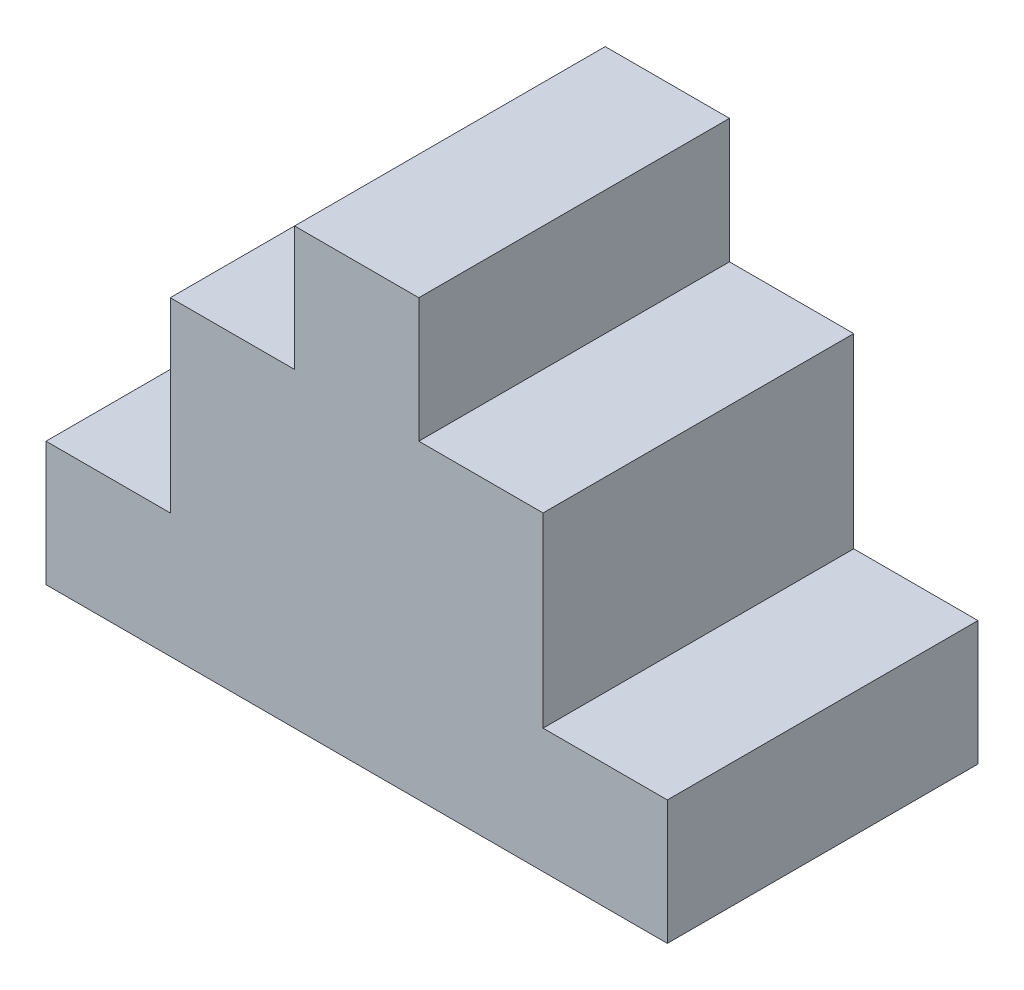
ISO-10303-21;
HEADER;
FILE_DESCRIPTION(('STEP AP214'),'2;1');
FILE_NAME('part.step','',(''),(''),'','','');
FILE_SCHEMA(('AUTOMOTIVE_DESIGN { 1 0 10303 214 1 1 1 1 }'));
ENDSEC;
DATA;
#1=APPLICATION_CONTEXT('core data for automotive mechanical design processes');
#2=APPLICATION_PROTOCOL_DEFINITION('international standard','automotive_design',2000,#1);
#3=PRODUCT_CONTEXT('',#1,'mechanical');
#4=PRODUCT('Part','Part','',(#3));
#5=PRODUCT_RELATED_PRODUCT_CATEGORY('part','',(#4));
#6=PRODUCT_DEFINITION_FORMATION('','',#4);
#7=PRODUCT_DEFINITION_CONTEXT('part definition',#1,'design');
#8=PRODUCT_DEFINITION('design','',#6,#7);
#9=PRODUCT_DEFINITION_SHAPE('','',#8);
#10=(LENGTH_UNIT() NAMED_UNIT(*) SI_UNIT(.MILLI.,.METRE.));
#11=(NAMED_UNIT(*) PLANE_ANGLE_UNIT() SI_UNIT($,.RADIAN.));
#12=(NAMED_UNIT(*) SI_UNIT($,.STERADIAN.) SOLID_ANGLE_UNIT());
#13=UNCERTAINTY_MEASURE_WITH_UNIT(LENGTH_MEASURE(1.E-05),#10,'distance_accuracy_value','');
#14=(GEOMETRIC_REPRESENTATION_CONTEXT(3) GLOBAL_UNCERTAINTY_ASSIGNED_CONTEXT((#13)) GLOBAL_UNIT_ASSIGNED_CONTEXT((#10,
#11,#12)) REPRESENTATION_CONTEXT('',''));
#15=CARTESIAN_POINT('',(0.,0.,0.));
#16=DIRECTION('',(0.,0.,1.));
#17=DIRECTION('',(1.,0.,0.));
#18=AXIS2_PLACEMENT_3D('',#15,#16,#17);
#19=CARTESIAN_POINT('',(0.999999999999999,7.,2.5));
#20=DIRECTION('',(-1.,0.,0.));
#21=DIRECTION('',(0.,-1.,0.));
#22=AXIS2_PLACEMENT_3D('',#19,#20,#21);
#23=PLANE('',#22);
#24=DIRECTION('',(0.,1.,0.));
#25=VECTOR('',#24,1.);
#26=CARTESIAN_POINT('',(0.999999999999999,7.,-2.5));
#27=LINE('',#26,#25);
#28=CARTESIAN_POINT('',(1.,5.,-2.5));
#29=VERTEX_POINT('',#28);
#30=CARTESIAN_POINT('',(0.999999999999999,7.,-2.5));
#31=VERTEX_POINT('',#30);
#32=EDGE_CURVE('E157',#29,#31,#27,.T.);
#33=ORIENTED_EDGE('',*,*,#32,.T.);
#34=DIRECTION('',(0.,0.,-1.));
#35=VECTOR('',#34,1.);
#36=CARTESIAN_POINT('',(0.999999999999999,7.,2.5));
#37=LINE('',#36,#35);
#38=CARTESIAN_POINT('',(0.999999999999999,7.,2.5));
#39=VERTEX_POINT('',#38);
#40=EDGE_CURVE('E11',#39,#31,#37,.T.);
#41=ORIENTED_EDGE('',*,*,#40,.F.);
#42=DIRECTION('',(0.,1.,0.));
#43=VECTOR('',#42,1.);
#44=CARTESIAN_POINT('',(0.999999999999999,7.,2.5));
#45=LINE('',#44,#43);
#46=CARTESIAN_POINT('',(1.,5.,2.5));
#47=VERTEX_POINT('',#46);
#48=EDGE_CURVE('E179',#47,#39,#45,.T.);
#49=ORIENTED_EDGE('',*,*,#48,.F.);
#50=DIRECTION('',(0.,0.,-1.));
#51=VECTOR('',#50,1.);
#52=CARTESIAN_POINT('',(1.,5.,2.5));
#53=LINE('',#52,#51);
#54=EDGE_CURVE('E153',#47,#29,#53,.T.);
#55=ORIENTED_EDGE('',*,*,#54,.T.);
#56=EDGE_LOOP('',(#33,#41,#49,#55));
#57=FACE_BOUND('',#56,.T.);
#58=ADVANCED_FACE('F37',(#57),#23,.F.);
#59=CARTESIAN_POINT('',(-1.,7.,2.5));
#60=DIRECTION('',(0.,-1.,0.));
#61=DIRECTION('',(0.,0.,-1.));
#62=AXIS2_PLACEMENT_3D('',#59,#60,#61);
#63=PLANE('',#62);
#64=DIRECTION('',(-1.,0.,0.));
#65=VECTOR('',#64,1.);
#66=CARTESIAN_POINT('',(-1.,7.,-2.5));
#67=LINE('',#66,#65);
#68=CARTESIAN_POINT('',(-1.,7.,-2.5));
#69=VERTEX_POINT('',#68);
#70=EDGE_CURVE('E160',#31,#69,#67,.T.);
#71=ORIENTED_EDGE('',*,*,#70,.T.);
#72=DIRECTION('',(0.,0.,-1.));
#73=VECTOR('',#72,1.);
#74=CARTESIAN_POINT('',(-1.,7.,2.5));
#75=LINE('',#74,#73);
#76=CARTESIAN_POINT('',(-1.,7.,2.5));
#77=VERTEX_POINT('',#76);
#78=EDGE_CURVE('E45',#77,#69,#75,.T.);
#79=ORIENTED_EDGE('',*,*,#78,.F.);
#80=DIRECTION('',(-1.,0.,0.));
#81=VECTOR('',#80,1.);
#82=CARTESIAN_POINT('',(-1.,7.,2.5));
#83=LINE('',#82,#81);
#84=EDGE_CURVE('E108',#39,#77,#83,.T.);
#85=ORIENTED_EDGE('',*,*,#84,.F.);
#86=ORIENTED_EDGE('',*,*,#40,.T.);
#87=EDGE_LOOP('',(#71,#79,#85,#86));
#88=FACE_BOUND('',#87,.T.);
#89=ADVANCED_FACE('F257',(#88),#63,.F.);
#90=CARTESIAN_POINT('',(-1.,7.,2.5));
#91=DIRECTION('',(1.,0.,0.));
#92=DIRECTION('',(0.,1.,0.));
#93=AXIS2_PLACEMENT_3D('',#90,#91,#92);
#94=PLANE('',#93);
#95=DIRECTION('',(0.,-1.,0.));
#96=VECTOR('',#95,1.);
#97=CARTESIAN_POINT('',(-1.,7.,-2.5));
#98=LINE('',#97,#96);
#99=CARTESIAN_POINT('',(-1.,5.,-2.5));
#100=VERTEX_POINT('',#99);
#101=EDGE_CURVE('E162',#69,#100,#98,.T.);
#102=ORIENTED_EDGE('',*,*,#101,.T.);
#103=DIRECTION('',(0.,0.,-1.));
#104=VECTOR('',#103,1.);
#105=CARTESIAN_POINT('',(-1.,5.,2.5));
#106=LINE('',#105,#104);
#107=CARTESIAN_POINT('',(-1.,5.,2.5));
#108=VERTEX_POINT('',#107);
#109=EDGE_CURVE('E198',#108,#100,#106,.T.);
#110=ORIENTED_EDGE('',*,*,#109,.F.);
#111=DIRECTION('',(0.,-1.,0.));
#112=VECTOR('',#111,1.);
#113=CARTESIAN_POINT('',(-1.,7.,2.5));
#114=LINE('',#113,#112);
#115=EDGE_CURVE('E206',#77,#108,#114,.T.);
#116=ORIENTED_EDGE('',*,*,#115,.F.);
#117=ORIENTED_EDGE('',*,*,#78,.T.);
#118=EDGE_LOOP('',(#102,#110,#116,#117));
#119=FACE_BOUND('',#118,.T.);
#120=ADVANCED_FACE('F204',(#119),#94,.F.);
#121=CARTESIAN_POINT('',(-1.,5.,2.5));
#122=DIRECTION('',(0.,-1.,0.));
#123=DIRECTION('',(1.,0.,0.));
#124=AXIS2_PLACEMENT_3D('',#121,#122,#123);
#125=PLANE('',#124);
#126=DIRECTION('',(-1.,0.,0.));
#127=VECTOR('',#126,1.);
#128=CARTESIAN_POINT('',(-1.,5.,-2.5));
#129=LINE('',#128,#127);
#130=CARTESIAN_POINT('',(-3.,5.,-2.5));
#131=VERTEX_POINT('',#130);
#132=EDGE_CURVE('E164',#100,#131,#129,.T.);
#133=ORIENTED_EDGE('',*,*,#132,.T.);
#134=DIRECTION('',(0.,0.,-1.));
#135=VECTOR('',#134,1.);
#136=CARTESIAN_POINT('',(-3.,5.,2.5));
#137=LINE('',#136,#135);
#138=CARTESIAN_POINT('',(-3.,5.,2.5));
#139=VERTEX_POINT('',#138);
#140=EDGE_CURVE('E195',#139,#131,#137,.T.);
#141=ORIENTED_EDGE('',*,*,#140,.F.);
#142=DIRECTION('',(-1.,0.,0.));
#143=VECTOR('',#142,1.);
#144=CARTESIAN_POINT('',(-1.,5.,2.5));
#145=LINE('',#144,#143);
#146=EDGE_CURVE('E224',#108,#139,#145,.T.);
#147=ORIENTED_EDGE('',*,*,#146,.F.);
#148=ORIENTED_EDGE('',*,*,#109,.T.);
#149=EDGE_LOOP('',(#133,#141,#147,#148));
#150=FACE_BOUND('',#149,.T.);
#151=ADVANCED_FACE('F215',(#150),#125,.F.);
#152=CARTESIAN_POINT('',(-3.,5.,2.5));
#153=DIRECTION('',(1.,0.,0.));
#154=DIRECTION('',(0.,1.,0.));
#155=AXIS2_PLACEMENT_3D('',#152,#153,#154);
#156=PLANE('',#155);
#157=DIRECTION('',(0.,-1.,0.));
#158=VECTOR('',#157,1.);
#159=CARTESIAN_POINT('',(-3.,5.,-2.5));
#160=LINE('',#159,#158);
#161=CARTESIAN_POINT('',(-3.,2.,-2.5));
#162=VERTEX_POINT('',#161);
#163=EDGE_CURVE('E166',#131,#162,#160,.T.);
#164=ORIENTED_EDGE('',*,*,#163,.T.);
#165=DIRECTION('',(0.,0.,-1.));
#166=VECTOR('',#165,1.);
#167=CARTESIAN_POINT('',(-3.,2.,2.5));
#168=LINE('',#167,#166);
#169=CARTESIAN_POINT('',(-3.,2.,2.5));
#170=VERTEX_POINT('',#169);
#171=EDGE_CURVE('E192',#170,#162,#168,.T.);
#172=ORIENTED_EDGE('',*,*,#171,.F.);
#173=DIRECTION('',(0.,-1.,0.));
#174=VECTOR('',#173,1.);
#175=CARTESIAN_POINT('',(-3.,5.,2.5));
#176=LINE('',#175,#174);
#177=EDGE_CURVE('E221',#139,#170,#176,.T.);
#178=ORIENTED_EDGE('',*,*,#177,.F.);
#179=ORIENTED_EDGE('',*,*,#140,.T.);
#180=EDGE_LOOP('',(#164,#172,#178,#179));
#181=FACE_BOUND('',#180,.T.);
#182=ADVANCED_FACE('F219',(#181),#156,.F.);
#183=CARTESIAN_POINT('',(-3.,2.,2.5));
#184=DIRECTION('',(0.,-1.,0.));
#185=DIRECTION('',(1.,0.,0.));
#186=AXIS2_PLACEMENT_3D('',#183,#184,#185);
#187=PLANE('',#186);
#188=DIRECTION('',(-1.,0.,0.));
#189=VECTOR('',#188,1.);
#190=CARTESIAN_POINT('',(-3.,2.,-2.5));
#191=LINE('',#190,#189);
#192=CARTESIAN_POINT('',(-5.,2.,-2.5));
#193=VERTEX_POINT('',#192);
#194=EDGE_CURVE('E168',#162,#193,#191,.T.);
#195=ORIENTED_EDGE('',*,*,#194,.T.);
#196=DIRECTION('',(0.,0.,-1.));
#197=VECTOR('',#196,1.);
#198=CARTESIAN_POINT('',(-5.,2.,2.5));
#199=LINE('',#198,#197);
#200=CARTESIAN_POINT('',(-5.,2.,2.5));
#201=VERTEX_POINT('',#200);
#202=EDGE_CURVE('E189',#201,#193,#199,.T.);
#203=ORIENTED_EDGE('',*,*,#202,.F.);
#204=DIRECTION('',(-1.,0.,0.));
#205=VECTOR('',#204,1.);
#206=CARTESIAN_POINT('',(-3.,2.,2.5));
#207=LINE('',#206,#205);
#208=EDGE_CURVE('E223',#170,#201,#207,.T.);
#209=ORIENTED_EDGE('',*,*,#208,.F.);
#210=ORIENTED_EDGE('',*,*,#171,.T.);
#211=EDGE_LOOP('',(#195,#203,#209,#210));
#212=FACE_BOUND('',#211,.T.);
#213=ADVANCED_FACE('F270',(#212),#187,.F.);
#214=CARTESIAN_POINT('',(-5.,2.,2.5));
#215=DIRECTION('',(1.,0.,0.));
#216=DIRECTION('',(0.,1.,0.));
#217=AXIS2_PLACEMENT_3D('',#214,#215,#216);
#218=PLANE('',#217);
#219=DIRECTION('',(0.,-1.,0.));
#220=VECTOR('',#219,1.);
#221=CARTESIAN_POINT('',(-5.,2.,-2.5));
#222=LINE('',#221,#220);
#223=CARTESIAN_POINT('',(-5.,0.,-2.5));
#224=VERTEX_POINT('',#223);
#225=EDGE_CURVE('E170',#193,#224,#222,.T.);
#226=ORIENTED_EDGE('',*,*,#225,.T.);
#227=DIRECTION('',(0.,0.,-1.));
#228=VECTOR('',#227,1.);
#229=CARTESIAN_POINT('',(-5.,0.,2.5));
#230=LINE('',#229,#228);
#231=CARTESIAN_POINT('',(-5.,0.,2.5));
#232=VERTEX_POINT('',#231);
#233=EDGE_CURVE('E186',#232,#224,#230,.T.);
#234=ORIENTED_EDGE('',*,*,#233,.F.);
#235=DIRECTION('',(0.,-1.,0.));
#236=VECTOR('',#235,1.);
#237=CARTESIAN_POINT('',(-5.,2.,2.5));
#238=LINE('',#237,#236);
#239=EDGE_CURVE('E226',#201,#232,#238,.T.);
#240=ORIENTED_EDGE('',*,*,#239,.F.);
#241=ORIENTED_EDGE('',*,*,#202,.T.);
#242=EDGE_LOOP('',(#226,#234,#240,#241));
#243=FACE_BOUND('',#242,.T.);
#244=ADVANCED_FACE('F273',(#243),#218,.F.);
#245=CARTESIAN_POINT('',(5.,0.,2.5));
#246=DIRECTION('',(0.,1.,0.));
#247=DIRECTION('',(0.,0.,1.));
#248=AXIS2_PLACEMENT_3D('',#245,#246,#247);
#249=PLANE('',#248);
#250=DIRECTION('',(1.,0.,0.));
#251=VECTOR('',#250,1.);
#252=CARTESIAN_POINT('',(5.,0.,-2.5));
#253=LINE('',#252,#251);
#254=CARTESIAN_POINT('',(5.,0.,-2.5));
#255=VERTEX_POINT('',#254);
#256=EDGE_CURVE('E172',#224,#255,#253,.T.);
#257=ORIENTED_EDGE('',*,*,#256,.T.);
#258=DIRECTION('',(0.,0.,-1.));
#259=VECTOR('',#258,1.);
#260=CARTESIAN_POINT('',(5.,0.,2.5));
#261=LINE('',#260,#259);
#262=CARTESIAN_POINT('',(5.,0.,2.5));
#263=VERTEX_POINT('',#262);
#264=EDGE_CURVE('E183',#263,#255,#261,.T.);
#265=ORIENTED_EDGE('',*,*,#264,.F.);
#266=DIRECTION('',(1.,0.,0.));
#267=VECTOR('',#266,1.);
#268=CARTESIAN_POINT('',(5.,0.,2.5));
#269=LINE('',#268,#267);
#270=EDGE_CURVE('E232',#232,#263,#269,.T.);
#271=ORIENTED_EDGE('',*,*,#270,.F.);
#272=ORIENTED_EDGE('',*,*,#233,.T.);
#273=EDGE_LOOP('',(#257,#265,#271,#272));
#274=FACE_BOUND('',#273,.T.);
#275=ADVANCED_FACE('F238',(#274),#249,.F.);
#276=CARTESIAN_POINT('',(5.,2.,2.5));
#277=DIRECTION('',(-1.,0.,0.));
#278=DIRECTION('',(0.,-1.,0.));
#279=AXIS2_PLACEMENT_3D('',#276,#277,#278);
#280=PLANE('',#279);
#281=DIRECTION('',(0.,1.,0.));
#282=VECTOR('',#281,1.);
#283=CARTESIAN_POINT('',(5.,2.,-2.5));
#284=LINE('',#283,#282);
#285=CARTESIAN_POINT('',(5.,2.,-2.5));
#286=VERTEX_POINT('',#285);
#287=EDGE_CURVE('E174',#255,#286,#284,.T.);
#288=ORIENTED_EDGE('',*,*,#287,.T.);
#289=DIRECTION('',(0.,0.,-1.));
#290=VECTOR('',#289,1.);
#291=CARTESIAN_POINT('',(5.,2.,2.5));
#292=LINE('',#291,#290);
#293=CARTESIAN_POINT('',(5.,2.,2.5));
#294=VERTEX_POINT('',#293);
#295=EDGE_CURVE('E148',#294,#286,#292,.T.);
#296=ORIENTED_EDGE('',*,*,#295,.F.);
#297=DIRECTION('',(0.,1.,0.));
#298=VECTOR('',#297,1.);
#299=CARTESIAN_POINT('',(5.,2.,2.5));
#300=LINE('',#299,#298);
#301=EDGE_CURVE('E139',#263,#294,#300,.T.);
#302=ORIENTED_EDGE('',*,*,#301,.F.);
#303=ORIENTED_EDGE('',*,*,#264,.T.);
#304=EDGE_LOOP('',(#288,#296,#302,#303));
#305=FACE_BOUND('',#304,.T.);
#306=ADVANCED_FACE('F242',(#305),#280,.F.);
#307=CARTESIAN_POINT('',(3.,2.,2.5));
#308=DIRECTION('',(0.,-1.,0.));
#309=DIRECTION('',(1.,0.,0.));
#310=AXIS2_PLACEMENT_3D('',#307,#308,#309);
#311=PLANE('',#310);
#312=DIRECTION('',(-1.,0.,0.));
#313=VECTOR('',#312,1.);
#314=CARTESIAN_POINT('',(3.,2.,-2.5));
#315=LINE('',#314,#313);
#316=CARTESIAN_POINT('',(3.,2.,-2.5));
#317=VERTEX_POINT('',#316);
#318=EDGE_CURVE('E147',#286,#317,#315,.T.);
#319=ORIENTED_EDGE('',*,*,#318,.T.);
#320=DIRECTION('',(0.,0.,-1.));
#321=VECTOR('',#320,1.);
#322=CARTESIAN_POINT('',(3.,2.,2.5));
#323=LINE('',#322,#321);
#324=CARTESIAN_POINT('',(3.,2.,2.5));
#325=VERTEX_POINT('',#324);
#326=EDGE_CURVE('E144',#325,#317,#323,.T.);
#327=ORIENTED_EDGE('',*,*,#326,.F.);
#328=DIRECTION('',(-1.,0.,0.));
#329=VECTOR('',#328,1.);
#330=CARTESIAN_POINT('',(3.,2.,2.5));
#331=LINE('',#330,#329);
#332=EDGE_CURVE('E133',#294,#325,#331,.T.);
#333=ORIENTED_EDGE('',*,*,#332,.F.);
#334=ORIENTED_EDGE('',*,*,#295,.T.);
#335=EDGE_LOOP('',(#319,#327,#333,#334));
#336=FACE_BOUND('',#335,.T.);
#337=ADVANCED_FACE('F145',(#336),#311,.F.);
#338=CARTESIAN_POINT('',(3.,5.,2.5));
#339=DIRECTION('',(-1.,0.,0.));
#340=DIRECTION('',(0.,-1.,0.));
#341=AXIS2_PLACEMENT_3D('',#338,#339,#340);
#342=PLANE('',#341);
#343=DIRECTION('',(0.,1.,0.));
#344=VECTOR('',#343,1.);
#345=CARTESIAN_POINT('',(3.,5.,-2.5));
#346=LINE('',#345,#344);
#347=CARTESIAN_POINT('',(3.,5.,-2.5));
#348=VERTEX_POINT('',#347);
#349=EDGE_CURVE('E94',#317,#348,#346,.T.);
#350=ORIENTED_EDGE('',*,*,#349,.T.);
#351=DIRECTION('',(0.,0.,-1.));
#352=VECTOR('',#351,1.);
#353=CARTESIAN_POINT('',(3.,5.,2.5));
#354=LINE('',#353,#352);
#355=CARTESIAN_POINT('',(3.,5.,2.5));
#356=VERTEX_POINT('',#355);
#357=EDGE_CURVE('E149',#356,#348,#354,.T.);
#358=ORIENTED_EDGE('',*,*,#357,.F.);
#359=DIRECTION('',(0.,1.,0.));
#360=VECTOR('',#359,1.);
#361=CARTESIAN_POINT('',(3.,5.,2.5));
#362=LINE('',#361,#360);
#363=EDGE_CURVE('E137',#325,#356,#362,.T.);
#364=ORIENTED_EDGE('',*,*,#363,.F.);
#365=ORIENTED_EDGE('',*,*,#326,.T.);
#366=EDGE_LOOP('',(#350,#358,#364,#365));
#367=FACE_BOUND('',#366,.T.);
#368=ADVANCED_FACE('F151',(#367),#342,.F.);
#369=CARTESIAN_POINT('',(1.,5.,2.5));
#370=DIRECTION('',(0.,-1.,0.));
#371=DIRECTION('',(1.,0.,0.));
#372=AXIS2_PLACEMENT_3D('',#369,#370,#371);
#373=PLANE('',#372);
#374=DIRECTION('',(-1.,0.,0.));
#375=VECTOR('',#374,1.);
#376=CARTESIAN_POINT('',(1.,5.,-2.5));
#377=LINE('',#376,#375);
#378=EDGE_CURVE('E100',#348,#29,#377,.T.);
#379=ORIENTED_EDGE('',*,*,#378,.T.);
#380=ORIENTED_EDGE('',*,*,#54,.F.);
#381=DIRECTION('',(-1.,0.,0.));
#382=VECTOR('',#381,1.);
#383=CARTESIAN_POINT('',(1.,5.,2.5));
#384=LINE('',#383,#382);
#385=EDGE_CURVE('E53',#356,#47,#384,.T.);
#386=ORIENTED_EDGE('',*,*,#385,.F.);
#387=ORIENTED_EDGE('',*,*,#357,.T.);
#388=EDGE_LOOP('',(#379,#380,#386,#387));
#389=FACE_BOUND('',#388,.T.);
#390=ADVANCED_FACE('F246',(#389),#373,.F.);
#391=CARTESIAN_POINT('',(0.,0.,2.5));
#392=DIRECTION('',(0.,0.,1.));
#393=DIRECTION('',(1.,0.,0.));
#394=AXIS2_PLACEMENT_3D('',#391,#392,#393);
#395=PLANE('',#394);
#396=ORIENTED_EDGE('',*,*,#48,.T.);
#397=ORIENTED_EDGE('',*,*,#84,.T.);
#398=ORIENTED_EDGE('',*,*,#115,.T.);
#399=ORIENTED_EDGE('',*,*,#146,.T.);
#400=ORIENTED_EDGE('',*,*,#177,.T.);
#401=ORIENTED_EDGE('',*,*,#208,.T.);
#402=ORIENTED_EDGE('',*,*,#239,.T.);
#403=ORIENTED_EDGE('',*,*,#270,.T.);
#404=ORIENTED_EDGE('',*,*,#301,.T.);
#405=ORIENTED_EDGE('',*,*,#332,.T.);
#406=ORIENTED_EDGE('',*,*,#363,.T.);
#407=ORIENTED_EDGE('',*,*,#385,.T.);
#408=EDGE_LOOP('',(#396,#397,#398,#399,#400,#401,#402,#403,#404,#405,#406,#407));
#409=FACE_BOUND('',#408,.T.);
#410=ADVANCED_FACE('F135',(#409),#395,.T.);
#411=CARTESIAN_POINT('',(0.,0.,-2.5));
#412=DIRECTION('',(0.,0.,1.));
#413=DIRECTION('',(1.,0.,0.));
#414=AXIS2_PLACEMENT_3D('',#411,#412,#413);
#415=PLANE('',#414);
#416=ORIENTED_EDGE('',*,*,#32,.F.);
#417=ORIENTED_EDGE('',*,*,#378,.F.);
#418=ORIENTED_EDGE('',*,*,#349,.F.);
#419=ORIENTED_EDGE('',*,*,#318,.F.);
#420=ORIENTED_EDGE('',*,*,#287,.F.);
#421=ORIENTED_EDGE('',*,*,#256,.F.);
#422=ORIENTED_EDGE('',*,*,#225,.F.);
#423=ORIENTED_EDGE('',*,*,#194,.F.);
#424=ORIENTED_EDGE('',*,*,#163,.F.);
#425=ORIENTED_EDGE('',*,*,#132,.F.);
#426=ORIENTED_EDGE('',*,*,#101,.F.);
#427=ORIENTED_EDGE('',*,*,#70,.F.);
#428=EDGE_LOOP('',(#416,#417,#418,#419,#420,#421,#422,#423,#424,#425,#426,#427));
#429=FACE_BOUND('',#428,.T.);
#430=ADVANCED_FACE('F210',(#429),#415,.F.);
#431=CLOSED_SHELL('',(#58,#89,#120,#151,#182,#213,#244,#275,#306,#337,#368,#390,#410,#430));
#432=MANIFOLD_SOLID_BREP('B2',#431);
#433=ADVANCED_BREP_SHAPE_REPRESENTATION('',(#18,#432),#14);
#434=SHAPE_DEFINITION_REPRESENTATION(#9,#433);
ENDSEC;
END-ISO-10303-21;
